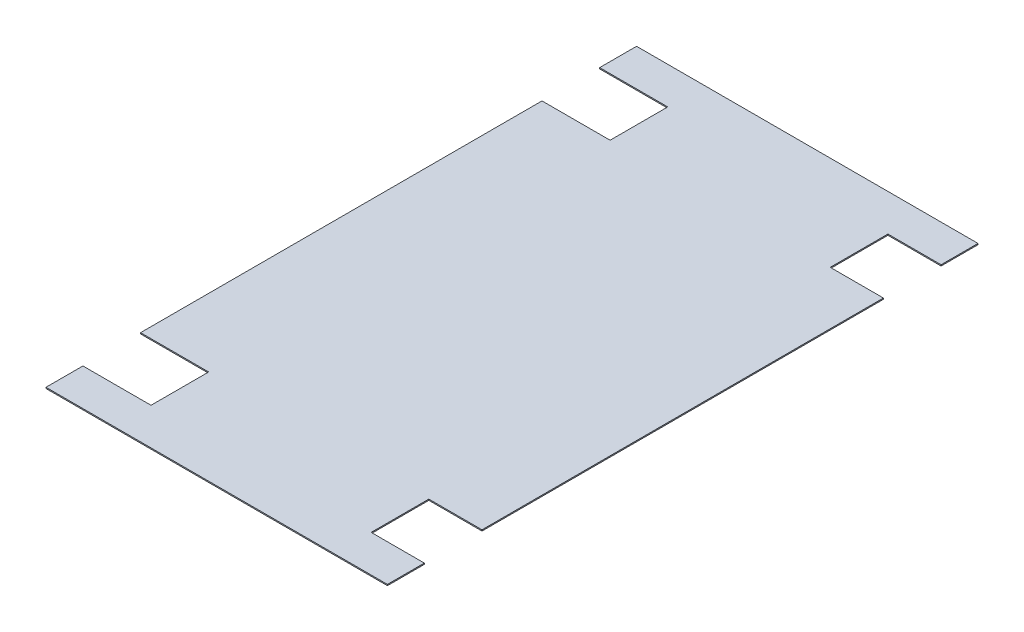
ISO-10303-21;
HEADER;
FILE_DESCRIPTION(('STEP AP214'),'2;1');
FILE_NAME('part.step','',(''),(''),'','','');
FILE_SCHEMA(('AUTOMOTIVE_DESIGN { 1 0 10303 214 1 1 1 1 }'));
ENDSEC;
DATA;
#1=APPLICATION_CONTEXT('core data for automotive mechanical design processes');
#2=APPLICATION_PROTOCOL_DEFINITION('international standard','automotive_design',2000,#1);
#3=PRODUCT_CONTEXT('',#1,'mechanical');
#4=PRODUCT('Part','Part','',(#3));
#5=PRODUCT_RELATED_PRODUCT_CATEGORY('part','',(#4));
#6=PRODUCT_DEFINITION_FORMATION('','',#4);
#7=PRODUCT_DEFINITION_CONTEXT('part definition',#1,'design');
#8=PRODUCT_DEFINITION('design','',#6,#7);
#9=PRODUCT_DEFINITION_SHAPE('','',#8);
#10=(LENGTH_UNIT() NAMED_UNIT(*) SI_UNIT(.MILLI.,.METRE.));
#11=(NAMED_UNIT(*) PLANE_ANGLE_UNIT() SI_UNIT($,.RADIAN.));
#12=(NAMED_UNIT(*) SI_UNIT($,.STERADIAN.) SOLID_ANGLE_UNIT());
#13=UNCERTAINTY_MEASURE_WITH_UNIT(LENGTH_MEASURE(1.E-05),#10,'distance_accuracy_value','');
#14=(GEOMETRIC_REPRESENTATION_CONTEXT(3) GLOBAL_UNCERTAINTY_ASSIGNED_CONTEXT((#13)) GLOBAL_UNIT_ASSIGNED_CONTEXT((#10,
#11,#12)) REPRESENTATION_CONTEXT('',''));
#15=CARTESIAN_POINT('',(0.,0.,0.));
#16=DIRECTION('',(0.,0.,1.));
#17=DIRECTION('',(1.,0.,0.));
#18=AXIS2_PLACEMENT_3D('',#15,#16,#17);
#19=CARTESIAN_POINT('',(-234.95,1.5875,406.4));
#20=DIRECTION('',(1.,0.,0.));
#21=DIRECTION('',(0.,0.,-1.));
#22=AXIS2_PLACEMENT_3D('',#19,#20,#21);
#23=PLANE('',#22);
#24=DIRECTION('',(0.,1.,0.));
#25=VECTOR('',#24,1.);
#26=CARTESIAN_POINT('',(-234.95,0.,-355.6));
#27=LINE('',#26,#25);
#28=CARTESIAN_POINT('',(-234.95,0.,-355.6));
#29=VERTEX_POINT('',#28);
#30=CARTESIAN_POINT('',(-234.95,1.5875,-355.6));
#31=VERTEX_POINT('',#30);
#32=EDGE_CURVE('E215',#29,#31,#27,.T.);
#33=ORIENTED_EDGE('',*,*,#32,.T.);
#34=DIRECTION('',(0.,0.,1.));
#35=VECTOR('',#34,1.);
#36=CARTESIAN_POINT('',(-234.95,1.5875,406.4));
#37=LINE('',#36,#35);
#38=CARTESIAN_POINT('',(-234.95,1.5875,-406.4));
#39=VERTEX_POINT('',#38);
#40=EDGE_CURVE('E373',#39,#31,#37,.T.);
#41=ORIENTED_EDGE('',*,*,#40,.F.);
#42=DIRECTION('',(0.,-1.,0.));
#43=VECTOR('',#42,1.);
#44=CARTESIAN_POINT('',(-234.95,1.5875,-406.4));
#45=LINE('',#44,#43);
#46=CARTESIAN_POINT('',(-234.95,0.,-406.4));
#47=VERTEX_POINT('',#46);
#48=EDGE_CURVE('E232',#39,#47,#45,.T.);
#49=ORIENTED_EDGE('',*,*,#48,.T.);
#50=DIRECTION('',(0.,0.,1.));
#51=VECTOR('',#50,1.);
#52=CARTESIAN_POINT('',(-234.95,0.,406.4));
#53=LINE('',#52,#51);
#54=EDGE_CURVE('E208',#47,#29,#53,.T.);
#55=ORIENTED_EDGE('',*,*,#54,.T.);
#56=EDGE_LOOP('',(#33,#41,#49,#55));
#57=FACE_BOUND('',#56,.T.);
#58=ADVANCED_FACE('F39',(#57),#23,.F.);
#59=DIRECTION('',(0.,1.,0.));
#60=VECTOR('',#59,1.);
#61=CARTESIAN_POINT('',(-234.95,0.,355.6));
#62=LINE('',#61,#60);
#63=CARTESIAN_POINT('',(-234.95,0.,355.6));
#64=VERTEX_POINT('',#63);
#65=CARTESIAN_POINT('',(-234.95,1.5875,355.6));
#66=VERTEX_POINT('',#65);
#67=EDGE_CURVE('E358',#64,#66,#62,.T.);
#68=ORIENTED_EDGE('',*,*,#67,.F.);
#69=CARTESIAN_POINT('',(-234.95,0.,406.4));
#70=VERTEX_POINT('',#69);
#71=EDGE_CURVE('E209',#64,#70,#53,.T.);
#72=ORIENTED_EDGE('',*,*,#71,.T.);
#73=DIRECTION('',(0.,-1.,0.));
#74=VECTOR('',#73,1.);
#75=CARTESIAN_POINT('',(-234.95,1.5875,406.4));
#76=LINE('',#75,#74);
#77=CARTESIAN_POINT('',(-234.95,1.5875,406.4));
#78=VERTEX_POINT('',#77);
#79=EDGE_CURVE('E12',#78,#70,#76,.T.);
#80=ORIENTED_EDGE('',*,*,#79,.F.);
#81=EDGE_CURVE('E231',#66,#78,#37,.T.);
#82=ORIENTED_EDGE('',*,*,#81,.F.);
#83=EDGE_LOOP('',(#68,#72,#80,#82));
#84=FACE_BOUND('',#83,.T.);
#85=ADVANCED_FACE('F415',(#84),#23,.F.);
#86=DIRECTION('',(0.,1.,0.));
#87=VECTOR('',#86,1.);
#88=CARTESIAN_POINT('',(-234.95,0.,276.225));
#89=LINE('',#88,#87);
#90=CARTESIAN_POINT('',(-234.95,0.,276.225));
#91=VERTEX_POINT('',#90);
#92=CARTESIAN_POINT('',(-234.95,1.5875,276.225));
#93=VERTEX_POINT('',#92);
#94=EDGE_CURVE('E200',#91,#93,#89,.T.);
#95=ORIENTED_EDGE('',*,*,#94,.T.);
#96=CARTESIAN_POINT('',(-234.95,1.5875,-276.225));
#97=VERTEX_POINT('',#96);
#98=EDGE_CURVE('E198',#97,#93,#37,.T.);
#99=ORIENTED_EDGE('',*,*,#98,.F.);
#100=DIRECTION('',(0.,1.,0.));
#101=VECTOR('',#100,1.);
#102=CARTESIAN_POINT('',(-234.95,0.,-276.225));
#103=LINE('',#102,#101);
#104=CARTESIAN_POINT('',(-234.95,0.,-276.225));
#105=VERTEX_POINT('',#104);
#106=EDGE_CURVE('E180',#105,#97,#103,.T.);
#107=ORIENTED_EDGE('',*,*,#106,.F.);
#108=EDGE_CURVE('E196',#105,#91,#53,.T.);
#109=ORIENTED_EDGE('',*,*,#108,.T.);
#110=EDGE_LOOP('',(#95,#99,#107,#109));
#111=FACE_BOUND('',#110,.T.);
#112=ADVANCED_FACE('F195',(#111),#23,.F.);
#113=CARTESIAN_POINT('',(234.95,1.5875,406.4));
#114=DIRECTION('',(-1.,0.,0.));
#115=DIRECTION('',(0.,0.,1.));
#116=AXIS2_PLACEMENT_3D('',#113,#114,#115);
#117=PLANE('',#116);
#118=DIRECTION('',(0.,1.,0.));
#119=VECTOR('',#118,1.);
#120=CARTESIAN_POINT('',(234.95,0.,-355.6));
#121=LINE('',#120,#119);
#122=CARTESIAN_POINT('',(234.95,0.,-355.6));
#123=VERTEX_POINT('',#122);
#124=CARTESIAN_POINT('',(234.95,1.5875,-355.6));
#125=VERTEX_POINT('',#124);
#126=EDGE_CURVE('E335',#123,#125,#121,.T.);
#127=ORIENTED_EDGE('',*,*,#126,.F.);
#128=DIRECTION('',(0.,0.,-1.));
#129=VECTOR('',#128,1.);
#130=CARTESIAN_POINT('',(234.95,0.,406.4));
#131=LINE('',#130,#129);
#132=CARTESIAN_POINT('',(234.95,0.,-406.4));
#133=VERTEX_POINT('',#132);
#134=EDGE_CURVE('E222',#123,#133,#131,.T.);
#135=ORIENTED_EDGE('',*,*,#134,.T.);
#136=DIRECTION('',(0.,-1.,0.));
#137=VECTOR('',#136,1.);
#138=CARTESIAN_POINT('',(234.95,1.5875,-406.4));
#139=LINE('',#138,#137);
#140=CARTESIAN_POINT('',(234.95,1.5875,-406.4));
#141=VERTEX_POINT('',#140);
#142=EDGE_CURVE('E236',#141,#133,#139,.T.);
#143=ORIENTED_EDGE('',*,*,#142,.F.);
#144=DIRECTION('',(0.,0.,-1.));
#145=VECTOR('',#144,1.);
#146=CARTESIAN_POINT('',(234.95,1.5875,406.4));
#147=LINE('',#146,#145);
#148=EDGE_CURVE('E379',#125,#141,#147,.T.);
#149=ORIENTED_EDGE('',*,*,#148,.F.);
#150=EDGE_LOOP('',(#127,#135,#143,#149));
#151=FACE_BOUND('',#150,.T.);
#152=ADVANCED_FACE('F395',(#151),#117,.F.);
#153=DIRECTION('',(0.,1.,0.));
#154=VECTOR('',#153,1.);
#155=CARTESIAN_POINT('',(234.95,0.,-276.225));
#156=LINE('',#155,#154);
#157=CARTESIAN_POINT('',(234.95,0.,-276.225));
#158=VERTEX_POINT('',#157);
#159=CARTESIAN_POINT('',(234.95,1.5875,-276.225));
#160=VERTEX_POINT('',#159);
#161=EDGE_CURVE('E62',#158,#160,#156,.T.);
#162=ORIENTED_EDGE('',*,*,#161,.T.);
#163=CARTESIAN_POINT('',(234.95,1.5875,276.225));
#164=VERTEX_POINT('',#163);
#165=EDGE_CURVE('E381',#164,#160,#147,.T.);
#166=ORIENTED_EDGE('',*,*,#165,.F.);
#167=DIRECTION('',(0.,1.,0.));
#168=VECTOR('',#167,1.);
#169=CARTESIAN_POINT('',(234.95,0.,276.225));
#170=LINE('',#169,#168);
#171=CARTESIAN_POINT('',(234.95,0.,276.225));
#172=VERTEX_POINT('',#171);
#173=EDGE_CURVE('E346',#172,#164,#170,.T.);
#174=ORIENTED_EDGE('',*,*,#173,.F.);
#175=EDGE_CURVE('E228',#172,#158,#131,.T.);
#176=ORIENTED_EDGE('',*,*,#175,.T.);
#177=EDGE_LOOP('',(#162,#166,#174,#176));
#178=FACE_BOUND('',#177,.T.);
#179=ADVANCED_FACE('F450',(#178),#117,.F.);
#180=DIRECTION('',(0.,1.,0.));
#181=VECTOR('',#180,1.);
#182=CARTESIAN_POINT('',(234.95,0.,355.6));
#183=LINE('',#182,#181);
#184=CARTESIAN_POINT('',(234.95,0.,355.6));
#185=VERTEX_POINT('',#184);
#186=CARTESIAN_POINT('',(234.95,1.5875,355.6));
#187=VERTEX_POINT('',#186);
#188=EDGE_CURVE('E355',#185,#187,#183,.T.);
#189=ORIENTED_EDGE('',*,*,#188,.T.);
#190=CARTESIAN_POINT('',(234.95,1.5875,406.4));
#191=VERTEX_POINT('',#190);
#192=EDGE_CURVE('E248',#191,#187,#147,.T.);
#193=ORIENTED_EDGE('',*,*,#192,.F.);
#194=DIRECTION('',(0.,-1.,0.));
#195=VECTOR('',#194,1.);
#196=CARTESIAN_POINT('',(234.95,1.5875,406.4));
#197=LINE('',#196,#195);
#198=CARTESIAN_POINT('',(234.95,0.,406.4));
#199=VERTEX_POINT('',#198);
#200=EDGE_CURVE('E47',#191,#199,#197,.T.);
#201=ORIENTED_EDGE('',*,*,#200,.T.);
#202=EDGE_CURVE('E223',#199,#185,#131,.T.);
#203=ORIENTED_EDGE('',*,*,#202,.T.);
#204=EDGE_LOOP('',(#189,#193,#201,#203));
#205=FACE_BOUND('',#204,.T.);
#206=ADVANCED_FACE('F246',(#205),#117,.F.);
#207=CARTESIAN_POINT('',(0.,1.5875,0.));
#208=DIRECTION('',(0.,1.,0.));
#209=DIRECTION('',(0.,0.,1.));
#210=AXIS2_PLACEMENT_3D('',#207,#208,#209);
#211=PLANE('',#210);
#212=DIRECTION('',(0.,0.,-1.));
#213=VECTOR('',#212,1.);
#214=CARTESIAN_POINT('',(161.769664855136,1.5875,-355.6));
#215=LINE('',#214,#213);
#216=CARTESIAN_POINT('',(161.769664855136,1.5875,-276.225));
#217=VERTEX_POINT('',#216);
#218=CARTESIAN_POINT('',(161.769664855136,1.5875,-355.6));
#219=VERTEX_POINT('',#218);
#220=EDGE_CURVE('E324',#217,#219,#215,.T.);
#221=ORIENTED_EDGE('',*,*,#220,.T.);
#222=DIRECTION('',(1.,0.,0.));
#223=VECTOR('',#222,1.);
#224=CARTESIAN_POINT('',(234.95,1.5875,-355.6));
#225=LINE('',#224,#223);
#226=EDGE_CURVE('E328',#219,#125,#225,.T.);
#227=ORIENTED_EDGE('',*,*,#226,.T.);
#228=ORIENTED_EDGE('',*,*,#148,.T.);
#229=DIRECTION('',(-1.,0.,0.));
#230=VECTOR('',#229,1.);
#231=CARTESIAN_POINT('',(234.95,1.5875,-406.4));
#232=LINE('',#231,#230);
#233=EDGE_CURVE('E218',#141,#39,#232,.T.);
#234=ORIENTED_EDGE('',*,*,#233,.T.);
#235=ORIENTED_EDGE('',*,*,#40,.T.);
#236=DIRECTION('',(1.,0.,0.));
#237=VECTOR('',#236,1.);
#238=CARTESIAN_POINT('',(-141.220731077096,1.5875,-355.6));
#239=LINE('',#238,#237);
#240=CARTESIAN_POINT('',(-141.220731077096,1.5875,-355.6));
#241=VERTEX_POINT('',#240);
#242=EDGE_CURVE('E285',#31,#241,#239,.T.);
#243=ORIENTED_EDGE('',*,*,#242,.T.);
#244=DIRECTION('',(0.,0.,1.));
#245=VECTOR('',#244,1.);
#246=CARTESIAN_POINT('',(-141.220731077096,1.5875,-276.225));
#247=LINE('',#246,#245);
#248=CARTESIAN_POINT('',(-141.220731077096,1.5875,-276.225));
#249=VERTEX_POINT('',#248);
#250=EDGE_CURVE('E289',#241,#249,#247,.T.);
#251=ORIENTED_EDGE('',*,*,#250,.T.);
#252=DIRECTION('',(-1.,0.,0.));
#253=VECTOR('',#252,1.);
#254=CARTESIAN_POINT('',(-234.95,1.5875,-276.225));
#255=LINE('',#254,#253);
#256=EDGE_CURVE('E293',#249,#97,#255,.T.);
#257=ORIENTED_EDGE('',*,*,#256,.T.);
#258=ORIENTED_EDGE('',*,*,#98,.T.);
#259=DIRECTION('',(1.,0.,0.));
#260=VECTOR('',#259,1.);
#261=CARTESIAN_POINT('',(-141.220731077096,1.5875,276.225));
#262=LINE('',#261,#260);
#263=CARTESIAN_POINT('',(-141.220731077096,1.5875,276.225));
#264=VERTEX_POINT('',#263);
#265=EDGE_CURVE('E296',#93,#264,#262,.T.);
#266=ORIENTED_EDGE('',*,*,#265,.T.);
#267=DIRECTION('',(0.,0.,1.));
#268=VECTOR('',#267,1.);
#269=CARTESIAN_POINT('',(-141.220731077096,1.5875,355.6));
#270=LINE('',#269,#268);
#271=CARTESIAN_POINT('',(-141.220731077096,1.5875,355.6));
#272=VERTEX_POINT('',#271);
#273=EDGE_CURVE('E300',#264,#272,#270,.T.);
#274=ORIENTED_EDGE('',*,*,#273,.T.);
#275=DIRECTION('',(-1.,0.,0.));
#276=VECTOR('',#275,1.);
#277=CARTESIAN_POINT('',(-234.95,1.5875,355.6));
#278=LINE('',#277,#276);
#279=EDGE_CURVE('E304',#272,#66,#278,.T.);
#280=ORIENTED_EDGE('',*,*,#279,.T.);
#281=ORIENTED_EDGE('',*,*,#81,.T.);
#282=DIRECTION('',(1.,0.,0.));
#283=VECTOR('',#282,1.);
#284=CARTESIAN_POINT('',(234.95,1.5875,406.4));
#285=LINE('',#284,#283);
#286=EDGE_CURVE('E377',#78,#191,#285,.T.);
#287=ORIENTED_EDGE('',*,*,#286,.T.);
#288=ORIENTED_EDGE('',*,*,#192,.T.);
#289=DIRECTION('',(-1.,0.,0.));
#290=VECTOR('',#289,1.);
#291=CARTESIAN_POINT('',(161.769664855136,1.5875,355.6));
#292=LINE('',#291,#290);
#293=CARTESIAN_POINT('',(161.769664855136,1.5875,355.6));
#294=VERTEX_POINT('',#293);
#295=EDGE_CURVE('E308',#187,#294,#292,.T.);
#296=ORIENTED_EDGE('',*,*,#295,.T.);
#297=DIRECTION('',(0.,0.,-1.));
#298=VECTOR('',#297,1.);
#299=CARTESIAN_POINT('',(161.769664855136,1.5875,276.225));
#300=LINE('',#299,#298);
#301=CARTESIAN_POINT('',(161.769664855136,1.5875,276.225));
#302=VERTEX_POINT('',#301);
#303=EDGE_CURVE('E312',#294,#302,#300,.T.);
#304=ORIENTED_EDGE('',*,*,#303,.T.);
#305=DIRECTION('',(1.,0.,0.));
#306=VECTOR('',#305,1.);
#307=CARTESIAN_POINT('',(234.95,1.5875,276.225));
#308=LINE('',#307,#306);
#309=EDGE_CURVE('E316',#302,#164,#308,.T.);
#310=ORIENTED_EDGE('',*,*,#309,.T.);
#311=ORIENTED_EDGE('',*,*,#165,.T.);
#312=DIRECTION('',(-1.,0.,0.));
#313=VECTOR('',#312,1.);
#314=CARTESIAN_POINT('',(161.769664855136,1.5875,-276.225));
#315=LINE('',#314,#313);
#316=EDGE_CURVE('E320',#160,#217,#315,.T.);
#317=ORIENTED_EDGE('',*,*,#316,.T.);
#318=EDGE_LOOP('',(#221,#227,#228,#234,#235,#243,#251,#257,#258,#266,#274,#280,#281,#287,#288,
#296,#304,#310,#311,#317));
#319=FACE_BOUND('',#318,.T.);
#320=ADVANCED_FACE('F389',(#319),#211,.T.);
#321=CARTESIAN_POINT('',(0.,0.,0.));
#322=DIRECTION('',(0.,1.,0.));
#323=DIRECTION('',(0.,0.,1.));
#324=AXIS2_PLACEMENT_3D('',#321,#322,#323);
#325=PLANE('',#324);
#326=DIRECTION('',(1.,0.,0.));
#327=VECTOR('',#326,1.);
#328=CARTESIAN_POINT('',(234.95,0.,-355.6));
#329=LINE('',#328,#327);
#330=CARTESIAN_POINT('',(161.769664855136,0.,-355.6));
#331=VERTEX_POINT('',#330);
#332=EDGE_CURVE('E281',#331,#123,#329,.T.);
#333=ORIENTED_EDGE('',*,*,#332,.F.);
#334=DIRECTION('',(0.,0.,-1.));
#335=VECTOR('',#334,1.);
#336=CARTESIAN_POINT('',(161.769664855136,0.,-355.6));
#337=LINE('',#336,#335);
#338=CARTESIAN_POINT('',(161.769664855136,0.,-276.225));
#339=VERTEX_POINT('',#338);
#340=EDGE_CURVE('E277',#339,#331,#337,.T.);
#341=ORIENTED_EDGE('',*,*,#340,.F.);
#342=DIRECTION('',(-1.,0.,0.));
#343=VECTOR('',#342,1.);
#344=CARTESIAN_POINT('',(161.769664855136,0.,-276.225));
#345=LINE('',#344,#343);
#346=EDGE_CURVE('E274',#158,#339,#345,.T.);
#347=ORIENTED_EDGE('',*,*,#346,.F.);
#348=ORIENTED_EDGE('',*,*,#175,.F.);
#349=DIRECTION('',(1.,0.,0.));
#350=VECTOR('',#349,1.);
#351=CARTESIAN_POINT('',(234.95,0.,276.225));
#352=LINE('',#351,#350);
#353=CARTESIAN_POINT('',(161.769664855136,0.,276.225));
#354=VERTEX_POINT('',#353);
#355=EDGE_CURVE('E266',#354,#172,#352,.T.);
#356=ORIENTED_EDGE('',*,*,#355,.F.);
#357=DIRECTION('',(0.,0.,-1.));
#358=VECTOR('',#357,1.);
#359=CARTESIAN_POINT('',(161.769664855136,0.,276.225));
#360=LINE('',#359,#358);
#361=CARTESIAN_POINT('',(161.769664855136,0.,355.6));
#362=VERTEX_POINT('',#361);
#363=EDGE_CURVE('E259',#362,#354,#360,.T.);
#364=ORIENTED_EDGE('',*,*,#363,.F.);
#365=DIRECTION('',(-1.,0.,0.));
#366=VECTOR('',#365,1.);
#367=CARTESIAN_POINT('',(161.769664855136,0.,355.6));
#368=LINE('',#367,#366);
#369=EDGE_CURVE('E256',#185,#362,#368,.T.);
#370=ORIENTED_EDGE('',*,*,#369,.F.);
#371=ORIENTED_EDGE('',*,*,#202,.F.);
#372=DIRECTION('',(1.,0.,0.));
#373=VECTOR('',#372,1.);
#374=CARTESIAN_POINT('',(234.95,0.,406.4));
#375=LINE('',#374,#373);
#376=EDGE_CURVE('E214',#70,#199,#375,.T.);
#377=ORIENTED_EDGE('',*,*,#376,.F.);
#378=ORIENTED_EDGE('',*,*,#71,.F.);
#379=DIRECTION('',(-1.,0.,0.));
#380=VECTOR('',#379,1.);
#381=CARTESIAN_POINT('',(-234.95,0.,355.6));
#382=LINE('',#381,#380);
#383=CARTESIAN_POINT('',(-141.220731077096,0.,355.6));
#384=VERTEX_POINT('',#383);
#385=EDGE_CURVE('E262',#384,#64,#382,.T.);
#386=ORIENTED_EDGE('',*,*,#385,.F.);
#387=DIRECTION('',(0.,0.,1.));
#388=VECTOR('',#387,1.);
#389=CARTESIAN_POINT('',(-141.220731077096,0.,355.6));
#390=LINE('',#389,#388);
#391=CARTESIAN_POINT('',(-141.220731077096,0.,276.225));
#392=VERTEX_POINT('',#391);
#393=EDGE_CURVE('E268',#392,#384,#390,.T.);
#394=ORIENTED_EDGE('',*,*,#393,.F.);
#395=DIRECTION('',(1.,0.,0.));
#396=VECTOR('',#395,1.);
#397=CARTESIAN_POINT('',(-141.220731077096,0.,276.225));
#398=LINE('',#397,#396);
#399=EDGE_CURVE('E188',#91,#392,#398,.T.);
#400=ORIENTED_EDGE('',*,*,#399,.F.);
#401=ORIENTED_EDGE('',*,*,#108,.F.);
#402=DIRECTION('',(-1.,0.,0.));
#403=VECTOR('',#402,1.);
#404=CARTESIAN_POINT('',(-234.95,0.,-276.225));
#405=LINE('',#404,#403);
#406=CARTESIAN_POINT('',(-141.220731077096,0.,-276.225));
#407=VERTEX_POINT('',#406);
#408=EDGE_CURVE('E176',#407,#105,#405,.T.);
#409=ORIENTED_EDGE('',*,*,#408,.F.);
#410=DIRECTION('',(0.,0.,1.));
#411=VECTOR('',#410,1.);
#412=CARTESIAN_POINT('',(-141.220731077096,0.,-276.225));
#413=LINE('',#412,#411);
#414=CARTESIAN_POINT('',(-141.220731077096,0.,-355.6));
#415=VERTEX_POINT('',#414);
#416=EDGE_CURVE('E189',#415,#407,#413,.T.);
#417=ORIENTED_EDGE('',*,*,#416,.F.);
#418=DIRECTION('',(1.,0.,0.));
#419=VECTOR('',#418,1.);
#420=CARTESIAN_POINT('',(-141.220731077096,0.,-355.6));
#421=LINE('',#420,#419);
#422=EDGE_CURVE('E54',#29,#415,#421,.T.);
#423=ORIENTED_EDGE('',*,*,#422,.F.);
#424=ORIENTED_EDGE('',*,*,#54,.F.);
#425=DIRECTION('',(-1.,0.,0.));
#426=VECTOR('',#425,1.);
#427=CARTESIAN_POINT('',(234.95,0.,-406.4));
#428=LINE('',#427,#426);
#429=EDGE_CURVE('E227',#133,#47,#428,.T.);
#430=ORIENTED_EDGE('',*,*,#429,.F.);
#431=ORIENTED_EDGE('',*,*,#134,.F.);
#432=EDGE_LOOP('',(#333,#341,#347,#348,#356,#364,#370,#371,#377,#378,#386,#394,#400,#401,#409,
#417,#423,#424,#430,#431));
#433=FACE_BOUND('',#432,.T.);
#434=ADVANCED_FACE('F204',(#433),#325,.F.);
#435=CARTESIAN_POINT('',(234.95,1.5875,406.4));
#436=DIRECTION('',(0.,0.,-1.));
#437=DIRECTION('',(-1.,0.,0.));
#438=AXIS2_PLACEMENT_3D('',#435,#436,#437);
#439=PLANE('',#438);
#440=ORIENTED_EDGE('',*,*,#376,.T.);
#441=ORIENTED_EDGE('',*,*,#200,.F.);
#442=ORIENTED_EDGE('',*,*,#286,.F.);
#443=ORIENTED_EDGE('',*,*,#79,.T.);
#444=EDGE_LOOP('',(#440,#441,#442,#443));
#445=FACE_BOUND('',#444,.T.);
#446=ADVANCED_FACE('F414',(#445),#439,.F.);
#447=CARTESIAN_POINT('',(234.95,1.5875,-406.4));
#448=DIRECTION('',(0.,0.,1.));
#449=DIRECTION('',(1.,0.,0.));
#450=AXIS2_PLACEMENT_3D('',#447,#448,#449);
#451=PLANE('',#450);
#452=ORIENTED_EDGE('',*,*,#429,.T.);
#453=ORIENTED_EDGE('',*,*,#48,.F.);
#454=ORIENTED_EDGE('',*,*,#233,.F.);
#455=ORIENTED_EDGE('',*,*,#142,.T.);
#456=EDGE_LOOP('',(#452,#453,#454,#455));
#457=FACE_BOUND('',#456,.T.);
#458=ADVANCED_FACE('F399',(#457),#451,.F.);
#459=CARTESIAN_POINT('',(-141.220731077096,0.,-276.225));
#460=DIRECTION('',(-1.,0.,0.));
#461=DIRECTION('',(0.,0.,1.));
#462=AXIS2_PLACEMENT_3D('',#459,#460,#461);
#463=PLANE('',#462);
#464=ORIENTED_EDGE('',*,*,#250,.F.);
#465=DIRECTION('',(0.,1.,0.));
#466=VECTOR('',#465,1.);
#467=CARTESIAN_POINT('',(-141.220731077096,0.,-355.6));
#468=LINE('',#467,#466);
#469=EDGE_CURVE('E284',#415,#241,#468,.T.);
#470=ORIENTED_EDGE('',*,*,#469,.F.);
#471=ORIENTED_EDGE('',*,*,#416,.T.);
#472=DIRECTION('',(0.,1.,0.));
#473=VECTOR('',#472,1.);
#474=CARTESIAN_POINT('',(-141.220731077096,0.,-276.225));
#475=LINE('',#474,#473);
#476=EDGE_CURVE('E182',#407,#249,#475,.T.);
#477=ORIENTED_EDGE('',*,*,#476,.T.);
#478=EDGE_LOOP('',(#464,#470,#471,#477));
#479=FACE_BOUND('',#478,.T.);
#480=ADVANCED_FACE('F406',(#479),#463,.T.);
#481=CARTESIAN_POINT('',(-234.95,0.,-276.225));
#482=DIRECTION('',(0.,0.,-1.));
#483=DIRECTION('',(-1.,0.,0.));
#484=AXIS2_PLACEMENT_3D('',#481,#482,#483);
#485=PLANE('',#484);
#486=ORIENTED_EDGE('',*,*,#256,.F.);
#487=ORIENTED_EDGE('',*,*,#476,.F.);
#488=ORIENTED_EDGE('',*,*,#408,.T.);
#489=ORIENTED_EDGE('',*,*,#106,.T.);
#490=EDGE_LOOP('',(#486,#487,#488,#489));
#491=FACE_BOUND('',#490,.T.);
#492=ADVANCED_FACE('F179',(#491),#485,.T.);
#493=CARTESIAN_POINT('',(-141.220731077096,0.,-355.6));
#494=DIRECTION('',(0.,0.,1.));
#495=DIRECTION('',(1.,0.,0.));
#496=AXIS2_PLACEMENT_3D('',#493,#494,#495);
#497=PLANE('',#496);
#498=ORIENTED_EDGE('',*,*,#242,.F.);
#499=ORIENTED_EDGE('',*,*,#32,.F.);
#500=ORIENTED_EDGE('',*,*,#422,.T.);
#501=ORIENTED_EDGE('',*,*,#469,.T.);
#502=EDGE_LOOP('',(#498,#499,#500,#501));
#503=FACE_BOUND('',#502,.T.);
#504=ADVANCED_FACE('F404',(#503),#497,.T.);
#505=CARTESIAN_POINT('',(-141.220731077096,0.,276.225));
#506=DIRECTION('',(0.,0.,1.));
#507=DIRECTION('',(1.,0.,0.));
#508=AXIS2_PLACEMENT_3D('',#505,#506,#507);
#509=PLANE('',#508);
#510=ORIENTED_EDGE('',*,*,#265,.F.);
#511=ORIENTED_EDGE('',*,*,#94,.F.);
#512=ORIENTED_EDGE('',*,*,#399,.T.);
#513=DIRECTION('',(0.,1.,0.));
#514=VECTOR('',#513,1.);
#515=CARTESIAN_POINT('',(-141.220731077096,0.,276.225));
#516=LINE('',#515,#514);
#517=EDGE_CURVE('E364',#392,#264,#516,.T.);
#518=ORIENTED_EDGE('',*,*,#517,.T.);
#519=EDGE_LOOP('',(#510,#511,#512,#518));
#520=FACE_BOUND('',#519,.T.);
#521=ADVANCED_FACE('F431',(#520),#509,.T.);
#522=CARTESIAN_POINT('',(-141.220731077096,0.,355.6));
#523=DIRECTION('',(-1.,0.,0.));
#524=DIRECTION('',(0.,0.,1.));
#525=AXIS2_PLACEMENT_3D('',#522,#523,#524);
#526=PLANE('',#525);
#527=ORIENTED_EDGE('',*,*,#273,.F.);
#528=ORIENTED_EDGE('',*,*,#517,.F.);
#529=ORIENTED_EDGE('',*,*,#393,.T.);
#530=DIRECTION('',(0.,1.,0.));
#531=VECTOR('',#530,1.);
#532=CARTESIAN_POINT('',(-141.220731077096,0.,355.6));
#533=LINE('',#532,#531);
#534=EDGE_CURVE('E361',#384,#272,#533,.T.);
#535=ORIENTED_EDGE('',*,*,#534,.T.);
#536=EDGE_LOOP('',(#527,#528,#529,#535));
#537=FACE_BOUND('',#536,.T.);
#538=ADVANCED_FACE('F422',(#537),#526,.T.);
#539=CARTESIAN_POINT('',(-234.95,0.,355.6));
#540=DIRECTION('',(0.,0.,-1.));
#541=DIRECTION('',(-1.,0.,0.));
#542=AXIS2_PLACEMENT_3D('',#539,#540,#541);
#543=PLANE('',#542);
#544=ORIENTED_EDGE('',*,*,#279,.F.);
#545=ORIENTED_EDGE('',*,*,#534,.F.);
#546=ORIENTED_EDGE('',*,*,#385,.T.);
#547=ORIENTED_EDGE('',*,*,#67,.T.);
#548=EDGE_LOOP('',(#544,#545,#546,#547));
#549=FACE_BOUND('',#548,.T.);
#550=ADVANCED_FACE('F419',(#549),#543,.T.);
#551=CARTESIAN_POINT('',(161.769664855136,0.,355.6));
#552=DIRECTION('',(0.,0.,-1.));
#553=DIRECTION('',(-1.,0.,0.));
#554=AXIS2_PLACEMENT_3D('',#551,#552,#553);
#555=PLANE('',#554);
#556=ORIENTED_EDGE('',*,*,#295,.F.);
#557=ORIENTED_EDGE('',*,*,#188,.F.);
#558=ORIENTED_EDGE('',*,*,#369,.T.);
#559=DIRECTION('',(0.,1.,0.));
#560=VECTOR('',#559,1.);
#561=CARTESIAN_POINT('',(161.769664855136,0.,355.6));
#562=LINE('',#561,#560);
#563=EDGE_CURVE('E352',#362,#294,#562,.T.);
#564=ORIENTED_EDGE('',*,*,#563,.T.);
#565=EDGE_LOOP('',(#556,#557,#558,#564));
#566=FACE_BOUND('',#565,.T.);
#567=ADVANCED_FACE('F547',(#566),#555,.T.);
#568=CARTESIAN_POINT('',(161.769664855136,0.,276.225));
#569=DIRECTION('',(1.,0.,0.));
#570=DIRECTION('',(0.,0.,-1.));
#571=AXIS2_PLACEMENT_3D('',#568,#569,#570);
#572=PLANE('',#571);
#573=ORIENTED_EDGE('',*,*,#303,.F.);
#574=ORIENTED_EDGE('',*,*,#563,.F.);
#575=ORIENTED_EDGE('',*,*,#363,.T.);
#576=DIRECTION('',(0.,1.,0.));
#577=VECTOR('',#576,1.);
#578=CARTESIAN_POINT('',(161.769664855136,0.,276.225));
#579=LINE('',#578,#577);
#580=EDGE_CURVE('E349',#354,#302,#579,.T.);
#581=ORIENTED_EDGE('',*,*,#580,.T.);
#582=EDGE_LOOP('',(#573,#574,#575,#581));
#583=FACE_BOUND('',#582,.T.);
#584=ADVANCED_FACE('F555',(#583),#572,.T.);
#585=CARTESIAN_POINT('',(234.95,0.,276.225));
#586=DIRECTION('',(0.,0.,1.));
#587=DIRECTION('',(1.,0.,0.));
#588=AXIS2_PLACEMENT_3D('',#585,#586,#587);
#589=PLANE('',#588);
#590=ORIENTED_EDGE('',*,*,#309,.F.);
#591=ORIENTED_EDGE('',*,*,#580,.F.);
#592=ORIENTED_EDGE('',*,*,#355,.T.);
#593=ORIENTED_EDGE('',*,*,#173,.T.);
#594=EDGE_LOOP('',(#590,#591,#592,#593));
#595=FACE_BOUND('',#594,.T.);
#596=ADVANCED_FACE('F563',(#595),#589,.T.);
#597=CARTESIAN_POINT('',(234.95,0.,-355.6));
#598=DIRECTION('',(0.,0.,1.));
#599=DIRECTION('',(1.,0.,0.));
#600=AXIS2_PLACEMENT_3D('',#597,#598,#599);
#601=PLANE('',#600);
#602=ORIENTED_EDGE('',*,*,#226,.F.);
#603=DIRECTION('',(0.,1.,0.));
#604=VECTOR('',#603,1.);
#605=CARTESIAN_POINT('',(161.769664855136,0.,-355.6));
#606=LINE('',#605,#604);
#607=EDGE_CURVE('E338',#331,#219,#606,.T.);
#608=ORIENTED_EDGE('',*,*,#607,.F.);
#609=ORIENTED_EDGE('',*,*,#332,.T.);
#610=ORIENTED_EDGE('',*,*,#126,.T.);
#611=EDGE_LOOP('',(#602,#608,#609,#610));
#612=FACE_BOUND('',#611,.T.);
#613=ADVANCED_FACE('F572',(#612),#601,.T.);
#614=CARTESIAN_POINT('',(161.769664855136,0.,-355.6));
#615=DIRECTION('',(1.,0.,0.));
#616=DIRECTION('',(0.,0.,-1.));
#617=AXIS2_PLACEMENT_3D('',#614,#615,#616);
#618=PLANE('',#617);
#619=ORIENTED_EDGE('',*,*,#220,.F.);
#620=DIRECTION('',(0.,1.,0.));
#621=VECTOR('',#620,1.);
#622=CARTESIAN_POINT('',(161.769664855136,0.,-276.225));
#623=LINE('',#622,#621);
#624=EDGE_CURVE('E341',#339,#217,#623,.T.);
#625=ORIENTED_EDGE('',*,*,#624,.F.);
#626=ORIENTED_EDGE('',*,*,#340,.T.);
#627=ORIENTED_EDGE('',*,*,#607,.T.);
#628=EDGE_LOOP('',(#619,#625,#626,#627));
#629=FACE_BOUND('',#628,.T.);
#630=ADVANCED_FACE('F581',(#629),#618,.T.);
#631=CARTESIAN_POINT('',(161.769664855136,0.,-276.225));
#632=DIRECTION('',(0.,0.,-1.));
#633=DIRECTION('',(-1.,0.,0.));
#634=AXIS2_PLACEMENT_3D('',#631,#632,#633);
#635=PLANE('',#634);
#636=ORIENTED_EDGE('',*,*,#316,.F.);
#637=ORIENTED_EDGE('',*,*,#161,.F.);
#638=ORIENTED_EDGE('',*,*,#346,.T.);
#639=ORIENTED_EDGE('',*,*,#624,.T.);
#640=EDGE_LOOP('',(#636,#637,#638,#639));
#641=FACE_BOUND('',#640,.T.);
#642=ADVANCED_FACE('F590',(#641),#635,.T.);
#643=CLOSED_SHELL('',(#58,#85,#112,#152,#179,#206,#320,#434,#446,#458,#480,#492,#504,#521,#538,
#550,#567,#584,#596,#613,#630,#642));
#644=MANIFOLD_SOLID_BREP('B2',#643);
#645=ADVANCED_BREP_SHAPE_REPRESENTATION('',(#18,#644),#14);
#646=SHAPE_DEFINITION_REPRESENTATION(#9,#645);
ENDSEC;
END-ISO-10303-21;
